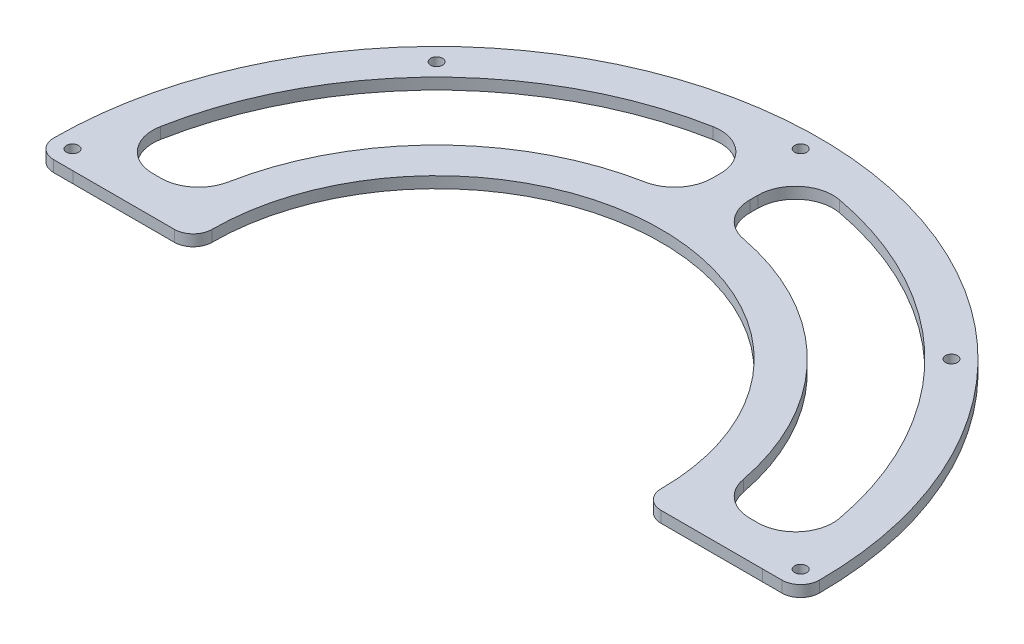
ISO-10303-21;
HEADER;
FILE_DESCRIPTION(('STEP AP214'),'2;1');
FILE_NAME('part.step','',(''),(''),'','','');
FILE_SCHEMA(('AUTOMOTIVE_DESIGN { 1 0 10303 214 1 1 1 1 }'));
ENDSEC;
DATA;
#1=APPLICATION_CONTEXT('core data for automotive mechanical design processes');
#2=APPLICATION_PROTOCOL_DEFINITION('international standard','automotive_design',2000,#1);
#3=PRODUCT_CONTEXT('',#1,'mechanical');
#4=PRODUCT('Part','Part','',(#3));
#5=PRODUCT_RELATED_PRODUCT_CATEGORY('part','',(#4));
#6=PRODUCT_DEFINITION_FORMATION('','',#4);
#7=PRODUCT_DEFINITION_CONTEXT('part definition',#1,'design');
#8=PRODUCT_DEFINITION('design','',#6,#7);
#9=PRODUCT_DEFINITION_SHAPE('','',#8);
#10=(LENGTH_UNIT() NAMED_UNIT(*) SI_UNIT(.MILLI.,.METRE.));
#11=(NAMED_UNIT(*) PLANE_ANGLE_UNIT() SI_UNIT($,.RADIAN.));
#12=(NAMED_UNIT(*) SI_UNIT($,.STERADIAN.) SOLID_ANGLE_UNIT());
#13=UNCERTAINTY_MEASURE_WITH_UNIT(LENGTH_MEASURE(1.E-05),#10,'distance_accuracy_value','');
#14=(GEOMETRIC_REPRESENTATION_CONTEXT(3) GLOBAL_UNCERTAINTY_ASSIGNED_CONTEXT((#13)) GLOBAL_UNIT_ASSIGNED_CONTEXT((#10,
#11,#12)) REPRESENTATION_CONTEXT('',''));
#15=CARTESIAN_POINT('',(0.,0.,0.));
#16=DIRECTION('',(0.,0.,1.));
#17=DIRECTION('',(1.,0.,0.));
#18=AXIS2_PLACEMENT_3D('',#15,#16,#17);
#19=CARTESIAN_POINT('',(14.9999999999932,3.,-80.514657050752));
#20=DIRECTION('',(0.,-1.,0.));
#21=DIRECTION('',(0.,0.,-1.));
#22=AXIS2_PLACEMENT_3D('',#19,#20,#21);
#23=CYLINDRICAL_SURFACE('',#22,9.99999999999999);
#24=CARTESIAN_POINT('',(14.9999999999932,0.,-80.514657050752));
#25=DIRECTION('',(0.,1.,0.));
#26=DIRECTION('',(0.,0.,1.));
#27=AXIS2_PLACEMENT_3D('',#24,#25,#26);
#28=CIRCLE('',#27,9.99999999999999);
#29=CARTESIAN_POINT('',(16.8315018314942,0.,-90.3455065074982));
#30=VERTEX_POINT('',#29);
#31=CARTESIAN_POINT('',(4.99999999999319,0.,-80.5146570507519));
#32=VERTEX_POINT('',#31);
#33=EDGE_CURVE('E358',#30,#32,#28,.T.);
#34=ORIENTED_EDGE('',*,*,#33,.F.);
#35=DIRECTION('',(0.,-1.,0.));
#36=VECTOR('',#35,1.);
#37=CARTESIAN_POINT('',(16.8315018314942,3.,-90.3455065074982));
#38=LINE('',#37,#36);
#39=CARTESIAN_POINT('',(16.8315018314942,3.,-90.3455065074982));
#40=VERTEX_POINT('',#39);
#41=EDGE_CURVE('E397',#40,#30,#38,.T.);
#42=ORIENTED_EDGE('',*,*,#41,.F.);
#43=CARTESIAN_POINT('',(14.9999999999932,3.,-80.514657050752));
#44=DIRECTION('',(0.,1.,0.));
#45=DIRECTION('',(0.,0.,1.));
#46=AXIS2_PLACEMENT_3D('',#43,#44,#45);
#47=CIRCLE('',#46,9.99999999999999);
#48=CARTESIAN_POINT('',(4.99999999999319,3.,-80.5146570507519));
#49=VERTEX_POINT('',#48);
#50=EDGE_CURVE('E285',#40,#49,#47,.T.);
#51=ORIENTED_EDGE('',*,*,#50,.T.);
#52=DIRECTION('',(0.,-1.,0.));
#53=VECTOR('',#52,1.);
#54=CARTESIAN_POINT('',(4.99999999999319,3.,-80.5146570507519));
#55=LINE('',#54,#53);
#56=EDGE_CURVE('E381',#49,#32,#55,.T.);
#57=ORIENTED_EDGE('',*,*,#56,.T.);
#58=EDGE_LOOP('',(#34,#42,#51,#57));
#59=FACE_BOUND('',#58,.T.);
#60=ADVANCED_FACE('F42',(#59),#23,.F.);
#61=CARTESIAN_POINT('',(0.,3.,0.));
#62=DIRECTION('',(0.,-1.,0.));
#63=DIRECTION('',(0.,0.,-1.));
#64=AXIS2_PLACEMENT_3D('',#61,#62,#63);
#65=CYLINDRICAL_SURFACE('',#64,91.9);
#66=CARTESIAN_POINT('',(0.,0.,0.));
#67=DIRECTION('',(0.,1.,0.));
#68=DIRECTION('',(0.,0.,1.));
#69=AXIS2_PLACEMENT_3D('',#66,#67,#68);
#70=CIRCLE('',#69,91.9);
#71=CARTESIAN_POINT('',(90.3455065074968,0.,-16.8315018315018));
#72=VERTEX_POINT('',#71);
#73=EDGE_CURVE('E361',#72,#30,#70,.T.);
#74=ORIENTED_EDGE('',*,*,#73,.F.);
#75=DIRECTION('',(0.,-1.,0.));
#76=VECTOR('',#75,1.);
#77=CARTESIAN_POINT('',(90.3455065074968,3.,-16.8315018315018));
#78=LINE('',#77,#76);
#79=CARTESIAN_POINT('',(90.3455065074968,3.,-16.8315018315018));
#80=VERTEX_POINT('',#79);
#81=EDGE_CURVE('E395',#80,#72,#78,.T.);
#82=ORIENTED_EDGE('',*,*,#81,.F.);
#83=CARTESIAN_POINT('',(0.,3.,0.));
#84=DIRECTION('',(0.,1.,0.));
#85=DIRECTION('',(0.,0.,1.));
#86=AXIS2_PLACEMENT_3D('',#83,#84,#85);
#87=CIRCLE('',#86,91.9);
#88=EDGE_CURVE('E288',#80,#40,#87,.T.);
#89=ORIENTED_EDGE('',*,*,#88,.T.);
#90=ORIENTED_EDGE('',*,*,#41,.T.);
#91=EDGE_LOOP('',(#74,#82,#89,#90));
#92=FACE_BOUND('',#91,.T.);
#93=ADVANCED_FACE('F499',(#92),#65,.F.);
#94=CARTESIAN_POINT('',(80.5146570507507,3.,-15.));
#95=DIRECTION('',(0.,-1.,0.));
#96=DIRECTION('',(0.,0.,-1.));
#97=AXIS2_PLACEMENT_3D('',#94,#95,#96);
#98=CYLINDRICAL_SURFACE('',#97,10.);
#99=CARTESIAN_POINT('',(80.5146570507507,0.,-15.));
#100=DIRECTION('',(0.,1.,0.));
#101=DIRECTION('',(0.,0.,1.));
#102=AXIS2_PLACEMENT_3D('',#99,#100,#101);
#103=CIRCLE('',#102,10.);
#104=CARTESIAN_POINT('',(80.5146570507507,0.,-5.));
#105=VERTEX_POINT('',#104);
#106=EDGE_CURVE('E364',#105,#72,#103,.T.);
#107=ORIENTED_EDGE('',*,*,#106,.F.);
#108=DIRECTION('',(0.,-1.,0.));
#109=VECTOR('',#108,1.);
#110=CARTESIAN_POINT('',(80.5146570507507,3.,-5.));
#111=LINE('',#110,#109);
#112=CARTESIAN_POINT('',(80.5146570507507,3.,-5.));
#113=VERTEX_POINT('',#112);
#114=EDGE_CURVE('E393',#113,#105,#111,.T.);
#115=ORIENTED_EDGE('',*,*,#114,.F.);
#116=CARTESIAN_POINT('',(80.5146570507507,3.,-15.));
#117=DIRECTION('',(0.,1.,0.));
#118=DIRECTION('',(0.,0.,1.));
#119=AXIS2_PLACEMENT_3D('',#116,#117,#118);
#120=CIRCLE('',#119,10.);
#121=EDGE_CURVE('E291',#113,#80,#120,.T.);
#122=ORIENTED_EDGE('',*,*,#121,.T.);
#123=ORIENTED_EDGE('',*,*,#81,.T.);
#124=EDGE_LOOP('',(#107,#115,#122,#123));
#125=FACE_BOUND('',#124,.T.);
#126=ADVANCED_FACE('F505',(#125),#98,.F.);
#127=CARTESIAN_POINT('',(0.,3.,-5.));
#128=DIRECTION('',(0.,0.,-1.));
#129=DIRECTION('',(-1.,0.,0.));
#130=AXIS2_PLACEMENT_3D('',#127,#128,#129);
#131=PLANE('',#130);
#132=DIRECTION('',(1.,0.,0.));
#133=VECTOR('',#132,1.);
#134=CARTESIAN_POINT('',(0.,0.,-5.));
#135=LINE('',#134,#133);
#136=CARTESIAN_POINT('',(78.3470031334958,0.,-5.));
#137=VERTEX_POINT('',#136);
#138=EDGE_CURVE('E367',#137,#105,#135,.T.);
#139=ORIENTED_EDGE('',*,*,#138,.F.);
#140=DIRECTION('',(0.,-1.,0.));
#141=VECTOR('',#140,1.);
#142=CARTESIAN_POINT('',(78.3470031334958,3.,-5.));
#143=LINE('',#142,#141);
#144=CARTESIAN_POINT('',(78.3470031334958,3.,-5.));
#145=VERTEX_POINT('',#144);
#146=EDGE_CURVE('E391',#145,#137,#143,.T.);
#147=ORIENTED_EDGE('',*,*,#146,.F.);
#148=DIRECTION('',(1.,0.,0.));
#149=VECTOR('',#148,1.);
#150=CARTESIAN_POINT('',(0.,3.,-5.));
#151=LINE('',#150,#149);
#152=EDGE_CURVE('E294',#145,#113,#151,.T.);
#153=ORIENTED_EDGE('',*,*,#152,.T.);
#154=ORIENTED_EDGE('',*,*,#114,.T.);
#155=EDGE_LOOP('',(#139,#147,#153,#154));
#156=FACE_BOUND('',#155,.T.);
#157=ADVANCED_FACE('F787',(#156),#131,.T.);
#158=CARTESIAN_POINT('',(78.3470031334958,3.,-15.));
#159=DIRECTION('',(0.,-1.,0.));
#160=DIRECTION('',(0.,0.,-1.));
#161=AXIS2_PLACEMENT_3D('',#158,#159,#160);
#162=CYLINDRICAL_SURFACE('',#161,9.99999999999999);
#163=CARTESIAN_POINT('',(78.3470031334958,0.,-15.));
#164=DIRECTION('',(0.,1.,0.));
#165=DIRECTION('',(0.,0.,1.));
#166=AXIS2_PLACEMENT_3D('',#163,#164,#165);
#167=CIRCLE('',#166,9.99999999999999);
#168=CARTESIAN_POINT('',(68.5253906057916,0.,-13.1195938322678));
#169=VERTEX_POINT('',#168);
#170=EDGE_CURVE('E370',#137,#169,#167,.F.);
#171=ORIENTED_EDGE('',*,*,#170,.T.);
#172=DIRECTION('',(0.,-1.,0.));
#173=VECTOR('',#172,1.);
#174=CARTESIAN_POINT('',(68.5253906057916,3.,-13.1195938322678));
#175=LINE('',#174,#173);
#176=CARTESIAN_POINT('',(68.5253906057916,3.,-13.1195938322678));
#177=VERTEX_POINT('',#176);
#178=EDGE_CURVE('E388',#177,#169,#175,.T.);
#179=ORIENTED_EDGE('',*,*,#178,.F.);
#180=CARTESIAN_POINT('',(78.3470031334958,3.,-15.));
#181=DIRECTION('',(0.,1.,0.));
#182=DIRECTION('',(0.,0.,1.));
#183=AXIS2_PLACEMENT_3D('',#180,#181,#182);
#184=CIRCLE('',#183,9.99999999999999);
#185=EDGE_CURVE('E297',#145,#177,#184,.F.);
#186=ORIENTED_EDGE('',*,*,#185,.F.);
#187=ORIENTED_EDGE('',*,*,#146,.T.);
#188=EDGE_LOOP('',(#171,#179,#186,#187));
#189=FACE_BOUND('',#188,.T.);
#190=ADVANCED_FACE('F776',(#189),#162,.F.);
#191=CARTESIAN_POINT('',(0.,3.,0.));
#192=DIRECTION('',(0.,-1.,0.));
#193=DIRECTION('',(0.,0.,-1.));
#194=AXIS2_PLACEMENT_3D('',#191,#192,#193);
#195=CYLINDRICAL_SURFACE('',#194,69.77);
#196=CARTESIAN_POINT('',(0.,0.,0.));
#197=DIRECTION('',(0.,1.,0.));
#198=DIRECTION('',(0.,0.,1.));
#199=AXIS2_PLACEMENT_3D('',#196,#197,#198);
#200=CIRCLE('',#199,69.77);
#201=CARTESIAN_POINT('',(13.1195938322618,0.,-68.5253906057928));
#202=VERTEX_POINT('',#201);
#203=EDGE_CURVE('E373',#169,#202,#200,.T.);
#204=ORIENTED_EDGE('',*,*,#203,.T.);
#205=DIRECTION('',(0.,-1.,0.));
#206=VECTOR('',#205,1.);
#207=CARTESIAN_POINT('',(13.1195938322618,3.,-68.5253906057928));
#208=LINE('',#207,#206);
#209=CARTESIAN_POINT('',(13.1195938322618,3.,-68.5253906057928));
#210=VERTEX_POINT('',#209);
#211=EDGE_CURVE('E386',#210,#202,#208,.T.);
#212=ORIENTED_EDGE('',*,*,#211,.F.);
#213=CARTESIAN_POINT('',(0.,3.,0.));
#214=DIRECTION('',(0.,1.,0.));
#215=DIRECTION('',(0.,0.,1.));
#216=AXIS2_PLACEMENT_3D('',#213,#214,#215);
#217=CIRCLE('',#216,69.77);
#218=EDGE_CURVE('E300',#177,#210,#217,.T.);
#219=ORIENTED_EDGE('',*,*,#218,.F.);
#220=ORIENTED_EDGE('',*,*,#178,.T.);
#221=EDGE_LOOP('',(#204,#212,#219,#220));
#222=FACE_BOUND('',#221,.T.);
#223=ADVANCED_FACE('F765',(#222),#195,.T.);
#224=CARTESIAN_POINT('',(14.9999999999932,3.,-78.3470031334971));
#225=DIRECTION('',(0.,-1.,0.));
#226=DIRECTION('',(0.,0.,-1.));
#227=AXIS2_PLACEMENT_3D('',#224,#225,#226);
#228=CYLINDRICAL_SURFACE('',#227,10.);
#229=CARTESIAN_POINT('',(14.9999999999932,0.,-78.3470031334971));
#230=DIRECTION('',(0.,1.,0.));
#231=DIRECTION('',(0.,0.,1.));
#232=AXIS2_PLACEMENT_3D('',#229,#230,#231);
#233=CIRCLE('',#232,10.);
#234=CARTESIAN_POINT('',(4.99999999999319,0.,-78.3470031334971));
#235=VERTEX_POINT('',#234);
#236=EDGE_CURVE('E376',#235,#202,#233,.T.);
#237=ORIENTED_EDGE('',*,*,#236,.F.);
#238=DIRECTION('',(0.,-1.,0.));
#239=VECTOR('',#238,1.);
#240=CARTESIAN_POINT('',(4.99999999999319,3.,-78.3470031334971));
#241=LINE('',#240,#239);
#242=CARTESIAN_POINT('',(4.99999999999319,3.,-78.3470031334971));
#243=VERTEX_POINT('',#242);
#244=EDGE_CURVE('E383',#243,#235,#241,.T.);
#245=ORIENTED_EDGE('',*,*,#244,.F.);
#246=CARTESIAN_POINT('',(14.9999999999932,3.,-78.3470031334971));
#247=DIRECTION('',(0.,1.,0.));
#248=DIRECTION('',(0.,0.,1.));
#249=AXIS2_PLACEMENT_3D('',#246,#247,#248);
#250=CIRCLE('',#249,10.);
#251=EDGE_CURVE('E302',#243,#210,#250,.T.);
#252=ORIENTED_EDGE('',*,*,#251,.T.);
#253=ORIENTED_EDGE('',*,*,#211,.T.);
#254=EDGE_LOOP('',(#237,#245,#252,#253));
#255=FACE_BOUND('',#254,.T.);
#256=ADVANCED_FACE('F612',(#255),#228,.F.);
#257=CARTESIAN_POINT('',(0.,3.,0.));
#258=DIRECTION('',(0.,-1.,0.));
#259=DIRECTION('',(0.,0.,-1.));
#260=AXIS2_PLACEMENT_3D('',#257,#258,#259);
#261=CYLINDRICAL_SURFACE('',#260,59.77);
#262=CARTESIAN_POINT('',(0.,0.,0.));
#263=DIRECTION('',(0.,1.,0.));
#264=DIRECTION('',(0.,0.,1.));
#265=AXIS2_PLACEMENT_3D('',#262,#263,#264);
#266=CIRCLE('',#265,59.77);
#267=CARTESIAN_POINT('',(59.77,0.,0.));
#268=VERTEX_POINT('',#267);
#269=CARTESIAN_POINT('',(-59.77,0.,0.));
#270=VERTEX_POINT('',#269);
#271=EDGE_CURVE('E327',#268,#270,#266,.T.);
#272=ORIENTED_EDGE('',*,*,#271,.F.);
#273=DIRECTION('',(0.,-1.,0.));
#274=VECTOR('',#273,1.);
#275=CARTESIAN_POINT('',(59.77,3.,0.));
#276=LINE('',#275,#274);
#277=CARTESIAN_POINT('',(59.77,3.,0.));
#278=VERTEX_POINT('',#277);
#279=EDGE_CURVE('E445',#268,#278,#276,.F.);
#280=ORIENTED_EDGE('',*,*,#279,.T.);
#281=CARTESIAN_POINT('',(0.,3.,0.));
#282=DIRECTION('',(0.,1.,0.));
#283=DIRECTION('',(0.,0.,1.));
#284=AXIS2_PLACEMENT_3D('',#281,#282,#283);
#285=CIRCLE('',#284,59.77);
#286=CARTESIAN_POINT('',(-59.77,3.,0.));
#287=VERTEX_POINT('',#286);
#288=EDGE_CURVE('E255',#278,#287,#285,.T.);
#289=ORIENTED_EDGE('',*,*,#288,.T.);
#290=DIRECTION('',(0.,-1.,0.));
#291=VECTOR('',#290,1.);
#292=CARTESIAN_POINT('',(-59.77,3.,0.));
#293=LINE('',#292,#291);
#294=EDGE_CURVE('E442',#287,#270,#293,.T.);
#295=ORIENTED_EDGE('',*,*,#294,.T.);
#296=EDGE_LOOP('',(#272,#280,#289,#295));
#297=FACE_BOUND('',#296,.T.);
#298=ADVANCED_FACE('F464',(#297),#261,.F.);
#299=CARTESIAN_POINT('',(0.,3.,5.));
#300=DIRECTION('',(0.,0.,1.));
#301=DIRECTION('',(1.,0.,0.));
#302=AXIS2_PLACEMENT_3D('',#299,#300,#301);
#303=PLANE('',#302);
#304=DIRECTION('',(-1.,0.,0.));
#305=VECTOR('',#304,1.);
#306=CARTESIAN_POINT('',(0.,3.,5.));
#307=LINE('',#306,#305);
#308=CARTESIAN_POINT('',(91.7638817836299,3.,5.));
#309=VERTEX_POINT('',#308);
#310=CARTESIAN_POINT('',(64.77,3.,5.));
#311=VERTEX_POINT('',#310);
#312=EDGE_CURVE('E257',#309,#311,#307,.T.);
#313=ORIENTED_EDGE('',*,*,#312,.T.);
#314=DIRECTION('',(0.,-1.,0.));
#315=VECTOR('',#314,1.);
#316=CARTESIAN_POINT('',(64.77,3.,5.));
#317=LINE('',#316,#315);
#318=CARTESIAN_POINT('',(64.77,0.,5.));
#319=VERTEX_POINT('',#318);
#320=EDGE_CURVE('E435',#311,#319,#317,.T.);
#321=ORIENTED_EDGE('',*,*,#320,.T.);
#322=DIRECTION('',(-1.,0.,0.));
#323=VECTOR('',#322,1.);
#324=CARTESIAN_POINT('',(0.,0.,5.));
#325=LINE('',#324,#323);
#326=CARTESIAN_POINT('',(91.7638817836299,0.,5.));
#327=VERTEX_POINT('',#326);
#328=EDGE_CURVE('E330',#327,#319,#325,.T.);
#329=ORIENTED_EDGE('',*,*,#328,.F.);
#330=DIRECTION('',(0.,-1.,0.));
#331=VECTOR('',#330,1.);
#332=CARTESIAN_POINT('',(91.7638817836299,3.,5.));
#333=LINE('',#332,#331);
#334=EDGE_CURVE('E384',#309,#327,#333,.T.);
#335=ORIENTED_EDGE('',*,*,#334,.F.);
#336=EDGE_LOOP('',(#313,#321,#329,#335));
#337=FACE_BOUND('',#336,.T.);
#338=ADVANCED_FACE('F454',(#337),#303,.T.);
#339=CARTESIAN_POINT('',(0.00303306051619236,3.,5.05505698707375));
#340=DIRECTION('',(-0.000600005099445556,0.,-0.999999819996924));
#341=DIRECTION('',(-0.999999819996924,0.,0.000600005099445556));
#342=AXIS2_PLACEMENT_3D('',#339,#340,#341);
#343=PLANE('',#342);
#344=DIRECTION('',(0.999999819996924,0.,-0.000600005099445556));
#345=VECTOR('',#344,1.);
#346=CARTESIAN_POINT('',(0.00303306051619236,0.,5.05505698707375));
#347=LINE('',#346,#345);
#348=CARTESIAN_POINT('',(96.9029999764652,0.,4.99691650232261));
#349=VERTEX_POINT('',#348);
#350=EDGE_CURVE('E333',#327,#349,#347,.T.);
#351=ORIENTED_EDGE('',*,*,#350,.T.);
#352=DIRECTION('',(0.,-1.,0.));
#353=VECTOR('',#352,1.);
#354=CARTESIAN_POINT('',(96.9029999764652,3.,4.99691650232261));
#355=LINE('',#354,#353);
#356=CARTESIAN_POINT('',(96.9029999764652,3.,4.99691650232261));
#357=VERTEX_POINT('',#356);
#358=EDGE_CURVE('E426',#349,#357,#355,.F.);
#359=ORIENTED_EDGE('',*,*,#358,.T.);
#360=DIRECTION('',(0.999999819996924,0.,-0.000600005099445556));
#361=VECTOR('',#360,1.);
#362=CARTESIAN_POINT('',(0.00303306051619236,3.,5.05505698707375));
#363=LINE('',#362,#361);
#364=EDGE_CURVE('E260',#309,#357,#363,.T.);
#365=ORIENTED_EDGE('',*,*,#364,.F.);
#366=ORIENTED_EDGE('',*,*,#334,.T.);
#367=EDGE_LOOP('',(#351,#359,#365,#366));
#368=FACE_BOUND('',#367,.T.);
#369=ADVANCED_FACE('F489',(#368),#343,.F.);
#370=CARTESIAN_POINT('',(0.,3.,0.));
#371=DIRECTION('',(0.,-1.,0.));
#372=DIRECTION('',(0.,0.,-1.));
#373=AXIS2_PLACEMENT_3D('',#370,#371,#372);
#374=CYLINDRICAL_SURFACE('',#373,101.9);
#375=CARTESIAN_POINT('',(0.,3.,0.));
#376=DIRECTION('',(0.,1.,0.));
#377=DIRECTION('',(0.,0.,1.));
#378=AXIS2_PLACEMENT_3D('',#375,#376,#377);
#379=CIRCLE('',#378,101.9);
#380=CARTESIAN_POINT('',(101.899999948438,3.,-0.00324165842888722));
#381=VERTEX_POINT('',#380);
#382=CARTESIAN_POINT('',(-101.899999948438,3.,-0.00324165842888863));
#383=VERTEX_POINT('',#382);
#384=EDGE_CURVE('E263',#381,#383,#379,.T.);
#385=ORIENTED_EDGE('',*,*,#384,.F.);
#386=DIRECTION('',(0.,-1.,0.));
#387=VECTOR('',#386,1.);
#388=CARTESIAN_POINT('',(101.899999948438,3.,-0.00324165842888722));
#389=LINE('',#388,#387);
#390=CARTESIAN_POINT('',(101.899999948438,0.,-0.00324165842888722));
#391=VERTEX_POINT('',#390);
#392=EDGE_CURVE('E419',#381,#391,#389,.T.);
#393=ORIENTED_EDGE('',*,*,#392,.T.);
#394=CARTESIAN_POINT('',(0.,0.,0.));
#395=DIRECTION('',(0.,1.,0.));
#396=DIRECTION('',(0.,0.,1.));
#397=AXIS2_PLACEMENT_3D('',#394,#395,#396);
#398=CIRCLE('',#397,101.9);
#399=CARTESIAN_POINT('',(-101.899999948438,0.,-0.00324165842888863));
#400=VERTEX_POINT('',#399);
#401=EDGE_CURVE('E336',#391,#400,#398,.T.);
#402=ORIENTED_EDGE('',*,*,#401,.T.);
#403=DIRECTION('',(0.,-1.,0.));
#404=VECTOR('',#403,1.);
#405=CARTESIAN_POINT('',(-101.899999948438,3.,-0.00324165842888863));
#406=LINE('',#405,#404);
#407=EDGE_CURVE('E399',#400,#383,#406,.F.);
#408=ORIENTED_EDGE('',*,*,#407,.T.);
#409=EDGE_LOOP('',(#385,#393,#402,#408));
#410=FACE_BOUND('',#409,.T.);
#411=ADVANCED_FACE('F480',(#410),#374,.T.);
#412=CARTESIAN_POINT('',(-0.00303306051619147,3.,5.05505698707373));
#413=DIRECTION('',(0.000600005099445382,0.,-0.999999819996924));
#414=DIRECTION('',(-0.999999819996924,0.,-0.000600005099445382));
#415=AXIS2_PLACEMENT_3D('',#412,#413,#414);
#416=PLANE('',#415);
#417=DIRECTION('',(0.999999819996924,0.,0.000600005099445382));
#418=VECTOR('',#417,1.);
#419=CARTESIAN_POINT('',(-0.00303306051619147,3.,5.05505698707373));
#420=LINE('',#419,#418);
#421=CARTESIAN_POINT('',(-96.9029999764652,3.,4.99691650232261));
#422=VERTEX_POINT('',#421);
#423=CARTESIAN_POINT('',(-91.7638817836299,3.,5.));
#424=VERTEX_POINT('',#423);
#425=EDGE_CURVE('E266',#422,#424,#420,.T.);
#426=ORIENTED_EDGE('',*,*,#425,.F.);
#427=DIRECTION('',(0.,-1.,0.));
#428=VECTOR('',#427,1.);
#429=CARTESIAN_POINT('',(-96.9029999764652,3.,4.99691650232261));
#430=LINE('',#429,#428);
#431=CARTESIAN_POINT('',(-96.9029999764652,0.,4.99691650232261));
#432=VERTEX_POINT('',#431);
#433=EDGE_CURVE('E432',#422,#432,#430,.T.);
#434=ORIENTED_EDGE('',*,*,#433,.T.);
#435=DIRECTION('',(0.999999819996924,0.,0.000600005099445382));
#436=VECTOR('',#435,1.);
#437=CARTESIAN_POINT('',(-0.00303306051619147,0.,5.05505698707373));
#438=LINE('',#437,#436);
#439=CARTESIAN_POINT('',(-91.7638817836299,0.,5.));
#440=VERTEX_POINT('',#439);
#441=EDGE_CURVE('E339',#432,#440,#438,.T.);
#442=ORIENTED_EDGE('',*,*,#441,.T.);
#443=DIRECTION('',(0.,-1.,0.));
#444=VECTOR('',#443,1.);
#445=CARTESIAN_POINT('',(-91.7638817836299,3.,5.));
#446=LINE('',#445,#444);
#447=EDGE_CURVE('E226',#424,#440,#446,.T.);
#448=ORIENTED_EDGE('',*,*,#447,.F.);
#449=EDGE_LOOP('',(#426,#434,#442,#448));
#450=FACE_BOUND('',#449,.T.);
#451=ADVANCED_FACE('F473',(#450),#416,.F.);
#452=CARTESIAN_POINT('',(0.,3.,0.));
#453=DIRECTION('',(0.,-1.,0.));
#454=DIRECTION('',(0.,0.,-1.));
#455=AXIS2_PLACEMENT_3D('',#452,#453,#454);
#456=CYLINDRICAL_SURFACE('',#455,91.9);
#457=CARTESIAN_POINT('',(0.,0.,0.));
#458=DIRECTION('',(0.,1.,0.));
#459=DIRECTION('',(0.,0.,1.));
#460=AXIS2_PLACEMENT_3D('',#457,#458,#459);
#461=CIRCLE('',#460,91.9);
#462=CARTESIAN_POINT('',(-16.8315018315095,0.,-90.3455065074954));
#463=VERTEX_POINT('',#462);
#464=CARTESIAN_POINT('',(-90.3455065074968,0.,-16.8315018315018));
#465=VERTEX_POINT('',#464);
#466=EDGE_CURVE('E221',#463,#465,#461,.T.);
#467=ORIENTED_EDGE('',*,*,#466,.F.);
#468=DIRECTION('',(0.,-1.,0.));
#469=VECTOR('',#468,1.);
#470=CARTESIAN_POINT('',(-16.8315018315095,3.,-90.3455065074954));
#471=LINE('',#470,#469);
#472=CARTESIAN_POINT('',(-16.8315018315095,3.,-90.3455065074954));
#473=VERTEX_POINT('',#472);
#474=EDGE_CURVE('E216',#473,#463,#471,.T.);
#475=ORIENTED_EDGE('',*,*,#474,.F.);
#476=CARTESIAN_POINT('',(0.,3.,0.));
#477=DIRECTION('',(0.,1.,0.));
#478=DIRECTION('',(0.,0.,1.));
#479=AXIS2_PLACEMENT_3D('',#476,#477,#478);
#480=CIRCLE('',#479,91.9);
#481=CARTESIAN_POINT('',(-90.3455065074968,3.,-16.8315018315018));
#482=VERTEX_POINT('',#481);
#483=EDGE_CURVE('E219',#473,#482,#480,.T.);
#484=ORIENTED_EDGE('',*,*,#483,.T.);
#485=DIRECTION('',(0.,-1.,0.));
#486=VECTOR('',#485,1.);
#487=CARTESIAN_POINT('',(-90.3455065074968,3.,-16.8315018315018));
#488=LINE('',#487,#486);
#489=EDGE_CURVE('E308',#482,#465,#488,.T.);
#490=ORIENTED_EDGE('',*,*,#489,.T.);
#491=EDGE_LOOP('',(#467,#475,#484,#490));
#492=FACE_BOUND('',#491,.T.);
#493=ADVANCED_FACE('F218',(#492),#456,.F.);
#494=CARTESIAN_POINT('',(-15.0000000000068,3.,-80.5146570507494));
#495=DIRECTION('',(0.,-1.,0.));
#496=DIRECTION('',(0.,0.,-1.));
#497=AXIS2_PLACEMENT_3D('',#494,#495,#496);
#498=CYLINDRICAL_SURFACE('',#497,9.99999999999999);
#499=CARTESIAN_POINT('',(-15.0000000000068,0.,-80.5146570507494));
#500=DIRECTION('',(0.,1.,0.));
#501=DIRECTION('',(0.,0.,1.));
#502=AXIS2_PLACEMENT_3D('',#499,#500,#501);
#503=CIRCLE('',#502,9.99999999999999);
#504=CARTESIAN_POINT('',(-5.00000000000684,0.,-80.5146570507494));
#505=VERTEX_POINT('',#504);
#506=EDGE_CURVE('E310',#505,#463,#503,.T.);
#507=ORIENTED_EDGE('',*,*,#506,.F.);
#508=DIRECTION('',(0.,-1.,0.));
#509=VECTOR('',#508,1.);
#510=CARTESIAN_POINT('',(-5.00000000000684,3.,-80.5146570507494));
#511=LINE('',#510,#509);
#512=CARTESIAN_POINT('',(-5.00000000000684,3.,-80.5146570507494));
#513=VERTEX_POINT('',#512);
#514=EDGE_CURVE('E227',#513,#505,#511,.T.);
#515=ORIENTED_EDGE('',*,*,#514,.F.);
#516=CARTESIAN_POINT('',(-15.0000000000068,3.,-80.5146570507494));
#517=DIRECTION('',(0.,1.,0.));
#518=DIRECTION('',(0.,0.,1.));
#519=AXIS2_PLACEMENT_3D('',#516,#517,#518);
#520=CIRCLE('',#519,9.99999999999999);
#521=EDGE_CURVE('E232',#513,#473,#520,.T.);
#522=ORIENTED_EDGE('',*,*,#521,.T.);
#523=ORIENTED_EDGE('',*,*,#474,.T.);
#524=EDGE_LOOP('',(#507,#515,#522,#523));
#525=FACE_BOUND('',#524,.T.);
#526=ADVANCED_FACE('F239',(#525),#498,.F.);
#527=CARTESIAN_POINT('',(-5.00000000000671,3.,0.));
#528=DIRECTION('',(1.,0.,0.));
#529=DIRECTION('',(0.,0.,-1.));
#530=AXIS2_PLACEMENT_3D('',#527,#528,#529);
#531=PLANE('',#530);
#532=DIRECTION('',(0.,0.,1.));
#533=VECTOR('',#532,1.);
#534=CARTESIAN_POINT('',(-5.00000000000671,0.,0.));
#535=LINE('',#534,#533);
#536=CARTESIAN_POINT('',(-5.00000000000684,0.,-78.3470031334945));
#537=VERTEX_POINT('',#536);
#538=EDGE_CURVE('E312',#505,#537,#535,.T.);
#539=ORIENTED_EDGE('',*,*,#538,.T.);
#540=DIRECTION('',(0.,-1.,0.));
#541=VECTOR('',#540,1.);
#542=CARTESIAN_POINT('',(-5.00000000000684,3.,-78.3470031334945));
#543=LINE('',#542,#541);
#544=CARTESIAN_POINT('',(-5.00000000000684,3.,-78.3470031334945));
#545=VERTEX_POINT('',#544);
#546=EDGE_CURVE('E414',#545,#537,#543,.T.);
#547=ORIENTED_EDGE('',*,*,#546,.F.);
#548=DIRECTION('',(0.,0.,1.));
#549=VECTOR('',#548,1.);
#550=CARTESIAN_POINT('',(-5.00000000000671,3.,0.));
#551=LINE('',#550,#549);
#552=EDGE_CURVE('E241',#513,#545,#551,.T.);
#553=ORIENTED_EDGE('',*,*,#552,.F.);
#554=ORIENTED_EDGE('',*,*,#514,.T.);
#555=EDGE_LOOP('',(#539,#547,#553,#554));
#556=FACE_BOUND('',#555,.T.);
#557=ADVANCED_FACE('F543',(#556),#531,.F.);
#558=CARTESIAN_POINT('',(-15.0000000000068,3.,-78.3470031334945));
#559=DIRECTION('',(0.,-1.,0.));
#560=DIRECTION('',(0.,0.,-1.));
#561=AXIS2_PLACEMENT_3D('',#558,#559,#560);
#562=CYLINDRICAL_SURFACE('',#561,10.);
#563=CARTESIAN_POINT('',(-15.0000000000068,0.,-78.3470031334945));
#564=DIRECTION('',(0.,1.,0.));
#565=DIRECTION('',(0.,0.,1.));
#566=AXIS2_PLACEMENT_3D('',#563,#564,#565);
#567=CIRCLE('',#566,10.);
#568=CARTESIAN_POINT('',(-13.1195938322737,0.,-68.5253906057905));
#569=VERTEX_POINT('',#568);
#570=EDGE_CURVE('E314',#537,#569,#567,.F.);
#571=ORIENTED_EDGE('',*,*,#570,.T.);
#572=DIRECTION('',(0.,-1.,0.));
#573=VECTOR('',#572,1.);
#574=CARTESIAN_POINT('',(-13.1195938322737,3.,-68.5253906057905));
#575=LINE('',#574,#573);
#576=CARTESIAN_POINT('',(-13.1195938322737,3.,-68.5253906057905));
#577=VERTEX_POINT('',#576);
#578=EDGE_CURVE('E411',#577,#569,#575,.T.);
#579=ORIENTED_EDGE('',*,*,#578,.F.);
#580=CARTESIAN_POINT('',(-15.0000000000068,3.,-78.3470031334945));
#581=DIRECTION('',(0.,1.,0.));
#582=DIRECTION('',(0.,0.,1.));
#583=AXIS2_PLACEMENT_3D('',#580,#581,#582);
#584=CIRCLE('',#583,10.);
#585=EDGE_CURVE('E243',#545,#577,#584,.F.);
#586=ORIENTED_EDGE('',*,*,#585,.F.);
#587=ORIENTED_EDGE('',*,*,#546,.T.);
#588=EDGE_LOOP('',(#571,#579,#586,#587));
#589=FACE_BOUND('',#588,.T.);
#590=ADVANCED_FACE('F726',(#589),#562,.F.);
#591=CARTESIAN_POINT('',(0.,3.,0.));
#592=DIRECTION('',(0.,-1.,0.));
#593=DIRECTION('',(0.,0.,-1.));
#594=AXIS2_PLACEMENT_3D('',#591,#592,#593);
#595=CYLINDRICAL_SURFACE('',#594,69.77);
#596=CARTESIAN_POINT('',(0.,0.,0.));
#597=DIRECTION('',(0.,1.,0.));
#598=DIRECTION('',(0.,0.,1.));
#599=AXIS2_PLACEMENT_3D('',#596,#597,#598);
#600=CIRCLE('',#599,69.77);
#601=CARTESIAN_POINT('',(-68.5253906057916,0.,-13.1195938322678));
#602=VERTEX_POINT('',#601);
#603=EDGE_CURVE('E316',#569,#602,#600,.T.);
#604=ORIENTED_EDGE('',*,*,#603,.T.);
#605=DIRECTION('',(0.,-1.,0.));
#606=VECTOR('',#605,1.);
#607=CARTESIAN_POINT('',(-68.5253906057916,3.,-13.1195938322678));
#608=LINE('',#607,#606);
#609=CARTESIAN_POINT('',(-68.5253906057916,3.,-13.1195938322678));
#610=VERTEX_POINT('',#609);
#611=EDGE_CURVE('E408',#610,#602,#608,.T.);
#612=ORIENTED_EDGE('',*,*,#611,.F.);
#613=CARTESIAN_POINT('',(0.,3.,0.));
#614=DIRECTION('',(0.,1.,0.));
#615=DIRECTION('',(0.,0.,1.));
#616=AXIS2_PLACEMENT_3D('',#613,#614,#615);
#617=CIRCLE('',#616,69.77);
#618=EDGE_CURVE('E247',#577,#610,#617,.T.);
#619=ORIENTED_EDGE('',*,*,#618,.F.);
#620=ORIENTED_EDGE('',*,*,#578,.T.);
#621=EDGE_LOOP('',(#604,#612,#619,#620));
#622=FACE_BOUND('',#621,.T.);
#623=ADVANCED_FACE('F715',(#622),#595,.T.);
#624=CARTESIAN_POINT('',(-78.3470031334958,3.,-15.));
#625=DIRECTION('',(0.,-1.,0.));
#626=DIRECTION('',(0.,0.,-1.));
#627=AXIS2_PLACEMENT_3D('',#624,#625,#626);
#628=CYLINDRICAL_SURFACE('',#627,9.99999999999999);
#629=CARTESIAN_POINT('',(-78.3470031334958,0.,-15.));
#630=DIRECTION('',(0.,1.,0.));
#631=DIRECTION('',(0.,0.,1.));
#632=AXIS2_PLACEMENT_3D('',#629,#630,#631);
#633=CIRCLE('',#632,9.99999999999999);
#634=CARTESIAN_POINT('',(-78.3470031334958,0.,-5.));
#635=VERTEX_POINT('',#634);
#636=EDGE_CURVE('E318',#602,#635,#633,.F.);
#637=ORIENTED_EDGE('',*,*,#636,.T.);
#638=DIRECTION('',(0.,-1.,0.));
#639=VECTOR('',#638,1.);
#640=CARTESIAN_POINT('',(-78.3470031334958,3.,-5.));
#641=LINE('',#640,#639);
#642=CARTESIAN_POINT('',(-78.3470031334958,3.,-5.));
#643=VERTEX_POINT('',#642);
#644=EDGE_CURVE('E406',#643,#635,#641,.T.);
#645=ORIENTED_EDGE('',*,*,#644,.F.);
#646=CARTESIAN_POINT('',(-78.3470031334958,3.,-15.));
#647=DIRECTION('',(0.,1.,0.));
#648=DIRECTION('',(0.,0.,1.));
#649=AXIS2_PLACEMENT_3D('',#646,#647,#648);
#650=CIRCLE('',#649,9.99999999999999);
#651=EDGE_CURVE('E249',#610,#643,#650,.F.);
#652=ORIENTED_EDGE('',*,*,#651,.F.);
#653=ORIENTED_EDGE('',*,*,#611,.T.);
#654=EDGE_LOOP('',(#637,#645,#652,#653));
#655=FACE_BOUND('',#654,.T.);
#656=ADVANCED_FACE('F704',(#655),#628,.F.);
#657=CARTESIAN_POINT('',(0.,3.,-5.));
#658=DIRECTION('',(0.,0.,-1.));
#659=DIRECTION('',(-1.,0.,0.));
#660=AXIS2_PLACEMENT_3D('',#657,#658,#659);
#661=PLANE('',#660);
#662=DIRECTION('',(1.,0.,0.));
#663=VECTOR('',#662,1.);
#664=CARTESIAN_POINT('',(0.,0.,-5.));
#665=LINE('',#664,#663);
#666=CARTESIAN_POINT('',(-80.5146570507507,0.,-5.));
#667=VERTEX_POINT('',#666);
#668=EDGE_CURVE('E321',#667,#635,#665,.T.);
#669=ORIENTED_EDGE('',*,*,#668,.F.);
#670=DIRECTION('',(0.,-1.,0.));
#671=VECTOR('',#670,1.);
#672=CARTESIAN_POINT('',(-80.5146570507507,3.,-5.));
#673=LINE('',#672,#671);
#674=CARTESIAN_POINT('',(-80.5146570507507,3.,-5.));
#675=VERTEX_POINT('',#674);
#676=EDGE_CURVE('E404',#675,#667,#673,.T.);
#677=ORIENTED_EDGE('',*,*,#676,.F.);
#678=DIRECTION('',(1.,0.,0.));
#679=VECTOR('',#678,1.);
#680=CARTESIAN_POINT('',(0.,3.,-5.));
#681=LINE('',#680,#679);
#682=EDGE_CURVE('E251',#675,#643,#681,.T.);
#683=ORIENTED_EDGE('',*,*,#682,.T.);
#684=ORIENTED_EDGE('',*,*,#644,.T.);
#685=EDGE_LOOP('',(#669,#677,#683,#684));
#686=FACE_BOUND('',#685,.T.);
#687=ADVANCED_FACE('F515',(#686),#661,.T.);
#688=CARTESIAN_POINT('',(0.,3.,-96.9));
#689=DIRECTION('',(0.,-1.,0.));
#690=DIRECTION('',(0.,0.,-1.));
#691=AXIS2_PLACEMENT_3D('',#688,#689,#690);
#692=CYLINDRICAL_SURFACE('',#691,1.6);
#693=CARTESIAN_POINT('',(0.,3.,-96.9));
#694=DIRECTION('',(0.,1.,0.));
#695=DIRECTION('',(0.,0.,1.));
#696=AXIS2_PLACEMENT_3D('',#693,#694,#695);
#697=CIRCLE('',#696,1.6);
#698=CARTESIAN_POINT('',(0.,3.,-95.3));
#699=VERTEX_POINT('',#698);
#700=EDGE_CURVE('E282',#699,#699,#697,.T.);
#701=ORIENTED_EDGE('',*,*,#700,.T.);
#702=EDGE_LOOP('',(#701));
#703=FACE_BOUND('',#702,.T.);
#704=CARTESIAN_POINT('',(0.,0.,-96.9));
#705=DIRECTION('',(0.,1.,0.));
#706=DIRECTION('',(0.,0.,1.));
#707=AXIS2_PLACEMENT_3D('',#704,#705,#706);
#708=CIRCLE('',#707,1.6);
#709=CARTESIAN_POINT('',(0.,0.,-95.3));
#710=VERTEX_POINT('',#709);
#711=EDGE_CURVE('E355',#710,#710,#708,.T.);
#712=ORIENTED_EDGE('',*,*,#711,.F.);
#713=EDGE_LOOP('',(#712));
#714=FACE_BOUND('',#713,.T.);
#715=ADVANCED_FACE('F511',(#703,#714),#692,.F.);
#716=CARTESIAN_POINT('',(68.5186470969766,3.,-68.5186470969764));
#717=DIRECTION('',(0.,-1.,0.));
#718=DIRECTION('',(0.,0.,-1.));
#719=AXIS2_PLACEMENT_3D('',#716,#717,#718);
#720=CYLINDRICAL_SURFACE('',#719,1.6);
#721=CARTESIAN_POINT('',(68.5186470969766,3.,-68.5186470969764));
#722=DIRECTION('',(0.,1.,0.));
#723=DIRECTION('',(0.,0.,1.));
#724=AXIS2_PLACEMENT_3D('',#721,#722,#723);
#725=CIRCLE('',#724,1.6);
#726=CARTESIAN_POINT('',(68.5186470969766,3.,-66.9186470969763));
#727=VERTEX_POINT('',#726);
#728=EDGE_CURVE('E279',#727,#727,#725,.T.);
#729=ORIENTED_EDGE('',*,*,#728,.T.);
#730=EDGE_LOOP('',(#729));
#731=FACE_BOUND('',#730,.T.);
#732=CARTESIAN_POINT('',(68.5186470969766,0.,-68.5186470969764));
#733=DIRECTION('',(0.,1.,0.));
#734=DIRECTION('',(0.,0.,1.));
#735=AXIS2_PLACEMENT_3D('',#732,#733,#734);
#736=CIRCLE('',#735,1.6);
#737=CARTESIAN_POINT('',(68.5186470969766,0.,-66.9186470969763));
#738=VERTEX_POINT('',#737);
#739=EDGE_CURVE('E352',#738,#738,#736,.T.);
#740=ORIENTED_EDGE('',*,*,#739,.F.);
#741=EDGE_LOOP('',(#740));
#742=FACE_BOUND('',#741,.T.);
#743=ADVANCED_FACE('F514',(#731,#742),#720,.F.);
#744=CARTESIAN_POINT('',(96.9,3.,3.383245417339E-13));
#745=DIRECTION('',(0.,-1.,0.));
#746=DIRECTION('',(0.,0.,-1.));
#747=AXIS2_PLACEMENT_3D('',#744,#745,#746);
#748=CYLINDRICAL_SURFACE('',#747,1.60000000000001);
#749=CARTESIAN_POINT('',(96.9,3.,3.383245417339E-13));
#750=DIRECTION('',(0.,1.,0.));
#751=DIRECTION('',(0.,0.,1.));
#752=AXIS2_PLACEMENT_3D('',#749,#750,#751);
#753=CIRCLE('',#752,1.60000000000001);
#754=CARTESIAN_POINT('',(96.9,3.,1.60000000000035));
#755=VERTEX_POINT('',#754);
#756=EDGE_CURVE('E276',#755,#755,#753,.T.);
#757=ORIENTED_EDGE('',*,*,#756,.T.);
#758=EDGE_LOOP('',(#757));
#759=FACE_BOUND('',#758,.T.);
#760=CARTESIAN_POINT('',(96.9,0.,3.383245417339E-13));
#761=DIRECTION('',(0.,1.,0.));
#762=DIRECTION('',(0.,0.,1.));
#763=AXIS2_PLACEMENT_3D('',#760,#761,#762);
#764=CIRCLE('',#763,1.60000000000001);
#765=CARTESIAN_POINT('',(96.9,0.,1.60000000000035));
#766=VERTEX_POINT('',#765);
#767=EDGE_CURVE('E349',#766,#766,#764,.T.);
#768=ORIENTED_EDGE('',*,*,#767,.F.);
#769=EDGE_LOOP('',(#768));
#770=FACE_BOUND('',#769,.T.);
#771=ADVANCED_FACE('F519',(#759,#770),#748,.F.);
#772=CARTESIAN_POINT('',(-96.9,3.,-1.0149736252017E-12));
#773=DIRECTION('',(0.,-1.,0.));
#774=DIRECTION('',(0.,0.,-1.));
#775=AXIS2_PLACEMENT_3D('',#772,#773,#774);
#776=CYLINDRICAL_SURFACE('',#775,1.60000000000001);
#777=CARTESIAN_POINT('',(-96.9,3.,-1.0149736252017E-12));
#778=DIRECTION('',(0.,1.,0.));
#779=DIRECTION('',(0.,0.,1.));
#780=AXIS2_PLACEMENT_3D('',#777,#778,#779);
#781=CIRCLE('',#780,1.60000000000001);
#782=CARTESIAN_POINT('',(-96.9,3.,1.59999999999899));
#783=VERTEX_POINT('',#782);
#784=EDGE_CURVE('E273',#783,#783,#781,.T.);
#785=ORIENTED_EDGE('',*,*,#784,.T.);
#786=EDGE_LOOP('',(#785));
#787=FACE_BOUND('',#786,.T.);
#788=CARTESIAN_POINT('',(-96.9,0.,-1.0149736252017E-12));
#789=DIRECTION('',(0.,1.,0.));
#790=DIRECTION('',(0.,0.,1.));
#791=AXIS2_PLACEMENT_3D('',#788,#789,#790);
#792=CIRCLE('',#791,1.60000000000001);
#793=CARTESIAN_POINT('',(-96.9,0.,1.59999999999899));
#794=VERTEX_POINT('',#793);
#795=EDGE_CURVE('E346',#794,#794,#792,.T.);
#796=ORIENTED_EDGE('',*,*,#795,.F.);
#797=EDGE_LOOP('',(#796));
#798=FACE_BOUND('',#797,.T.);
#799=ADVANCED_FACE('F523',(#787,#798),#776,.F.);
#800=CARTESIAN_POINT('',(-68.5186470969756,3.,-68.5186470969773));
#801=DIRECTION('',(0.,-1.,0.));
#802=DIRECTION('',(0.,0.,-1.));
#803=AXIS2_PLACEMENT_3D('',#800,#801,#802);
#804=CYLINDRICAL_SURFACE('',#803,1.59999999999999);
#805=CARTESIAN_POINT('',(-68.5186470969756,3.,-68.5186470969773));
#806=DIRECTION('',(0.,1.,0.));
#807=DIRECTION('',(0.,0.,1.));
#808=AXIS2_PLACEMENT_3D('',#805,#806,#807);
#809=CIRCLE('',#808,1.59999999999999);
#810=CARTESIAN_POINT('',(-68.5186470969756,3.,-66.9186470969773));
#811=VERTEX_POINT('',#810);
#812=EDGE_CURVE('E270',#811,#811,#809,.T.);
#813=ORIENTED_EDGE('',*,*,#812,.T.);
#814=EDGE_LOOP('',(#813));
#815=FACE_BOUND('',#814,.T.);
#816=CARTESIAN_POINT('',(-68.5186470969756,0.,-68.5186470969773));
#817=DIRECTION('',(0.,1.,0.));
#818=DIRECTION('',(0.,0.,1.));
#819=AXIS2_PLACEMENT_3D('',#816,#817,#818);
#820=CIRCLE('',#819,1.59999999999999);
#821=CARTESIAN_POINT('',(-68.5186470969756,0.,-66.9186470969773));
#822=VERTEX_POINT('',#821);
#823=EDGE_CURVE('E343',#822,#822,#820,.T.);
#824=ORIENTED_EDGE('',*,*,#823,.F.);
#825=EDGE_LOOP('',(#824));
#826=FACE_BOUND('',#825,.T.);
#827=ADVANCED_FACE('F527',(#815,#826),#804,.F.);
#828=CARTESIAN_POINT('',(0.,3.,5.));
#829=DIRECTION('',(0.,0.,-1.));
#830=DIRECTION('',(-1.,0.,0.));
#831=AXIS2_PLACEMENT_3D('',#828,#829,#830);
#832=PLANE('',#831);
#833=DIRECTION('',(1.,0.,0.));
#834=VECTOR('',#833,1.);
#835=CARTESIAN_POINT('',(0.,0.,5.));
#836=LINE('',#835,#834);
#837=CARTESIAN_POINT('',(-64.77,0.,5.));
#838=VERTEX_POINT('',#837);
#839=EDGE_CURVE('E341',#440,#838,#836,.T.);
#840=ORIENTED_EDGE('',*,*,#839,.T.);
#841=DIRECTION('',(0.,1.,0.));
#842=VECTOR('',#841,1.);
#843=CARTESIAN_POINT('',(-64.77,3.,5.));
#844=LINE('',#843,#842);
#845=CARTESIAN_POINT('',(-64.77,3.,5.));
#846=VERTEX_POINT('',#845);
#847=EDGE_CURVE('E11',#838,#846,#844,.T.);
#848=ORIENTED_EDGE('',*,*,#847,.T.);
#849=DIRECTION('',(1.,0.,0.));
#850=VECTOR('',#849,1.);
#851=CARTESIAN_POINT('',(0.,3.,5.));
#852=LINE('',#851,#850);
#853=EDGE_CURVE('E268',#424,#846,#852,.T.);
#854=ORIENTED_EDGE('',*,*,#853,.F.);
#855=ORIENTED_EDGE('',*,*,#447,.T.);
#856=EDGE_LOOP('',(#840,#848,#854,#855));
#857=FACE_BOUND('',#856,.T.);
#858=ADVANCED_FACE('F469',(#857),#832,.F.);
#859=CARTESIAN_POINT('',(-80.5146570507507,3.,-15.));
#860=DIRECTION('',(0.,-1.,0.));
#861=DIRECTION('',(0.,0.,-1.));
#862=AXIS2_PLACEMENT_3D('',#859,#860,#861);
#863=CYLINDRICAL_SURFACE('',#862,10.);
#864=CARTESIAN_POINT('',(-80.5146570507507,0.,-15.));
#865=DIRECTION('',(0.,1.,0.));
#866=DIRECTION('',(0.,0.,1.));
#867=AXIS2_PLACEMENT_3D('',#864,#865,#866);
#868=CIRCLE('',#867,10.);
#869=EDGE_CURVE('E324',#667,#465,#868,.F.);
#870=ORIENTED_EDGE('',*,*,#869,.T.);
#871=ORIENTED_EDGE('',*,*,#489,.F.);
#872=CARTESIAN_POINT('',(-80.5146570507507,3.,-15.));
#873=DIRECTION('',(0.,1.,0.));
#874=DIRECTION('',(0.,0.,1.));
#875=AXIS2_PLACEMENT_3D('',#872,#873,#874);
#876=CIRCLE('',#875,10.);
#877=EDGE_CURVE('E235',#675,#482,#876,.F.);
#878=ORIENTED_EDGE('',*,*,#877,.F.);
#879=ORIENTED_EDGE('',*,*,#676,.T.);
#880=EDGE_LOOP('',(#870,#871,#878,#879));
#881=FACE_BOUND('',#880,.T.);
#882=ADVANCED_FACE('F534',(#881),#863,.F.);
#883=CARTESIAN_POINT('',(4.99999999999319,3.,0.));
#884=DIRECTION('',(1.,0.,0.));
#885=DIRECTION('',(0.,0.,-1.));
#886=AXIS2_PLACEMENT_3D('',#883,#884,#885);
#887=PLANE('',#886);
#888=DIRECTION('',(0.,0.,1.));
#889=VECTOR('',#888,1.);
#890=CARTESIAN_POINT('',(4.99999999999319,0.,0.));
#891=LINE('',#890,#889);
#892=EDGE_CURVE('E237',#32,#235,#891,.T.);
#893=ORIENTED_EDGE('',*,*,#892,.F.);
#894=ORIENTED_EDGE('',*,*,#56,.F.);
#895=DIRECTION('',(0.,0.,1.));
#896=VECTOR('',#895,1.);
#897=CARTESIAN_POINT('',(4.99999999999319,3.,0.));
#898=LINE('',#897,#896);
#899=EDGE_CURVE('E305',#49,#243,#898,.T.);
#900=ORIENTED_EDGE('',*,*,#899,.T.);
#901=ORIENTED_EDGE('',*,*,#244,.T.);
#902=EDGE_LOOP('',(#893,#894,#900,#901));
#903=FACE_BOUND('',#902,.T.);
#904=ADVANCED_FACE('F583',(#903),#887,.T.);
#905=CARTESIAN_POINT('',(0.,3.,0.));
#906=DIRECTION('',(0.,1.,0.));
#907=DIRECTION('',(0.,0.,1.));
#908=AXIS2_PLACEMENT_3D('',#905,#906,#907);
#909=PLANE('',#908);
#910=ORIENTED_EDGE('',*,*,#483,.F.);
#911=ORIENTED_EDGE('',*,*,#521,.F.);
#912=ORIENTED_EDGE('',*,*,#552,.T.);
#913=ORIENTED_EDGE('',*,*,#585,.T.);
#914=ORIENTED_EDGE('',*,*,#618,.T.);
#915=ORIENTED_EDGE('',*,*,#651,.T.);
#916=ORIENTED_EDGE('',*,*,#682,.F.);
#917=ORIENTED_EDGE('',*,*,#877,.T.);
#918=EDGE_LOOP('',(#910,#911,#912,#913,#914,#915,#916,#917));
#919=FACE_BOUND('',#918,.T.);
#920=ORIENTED_EDGE('',*,*,#288,.F.);
#921=CARTESIAN_POINT('',(64.77,3.,0.));
#922=DIRECTION('',(0.,1.,0.));
#923=DIRECTION('',(0.,0.,1.));
#924=AXIS2_PLACEMENT_3D('',#921,#922,#923);
#925=CIRCLE('',#924,5.);
#926=EDGE_CURVE('E50',#278,#311,#925,.T.);
#927=ORIENTED_EDGE('',*,*,#926,.T.);
#928=ORIENTED_EDGE('',*,*,#312,.F.);
#929=ORIENTED_EDGE('',*,*,#364,.T.);
#930=CARTESIAN_POINT('',(96.899999950968,3.,-0.00308259766201346));
#931=DIRECTION('',(0.,1.,0.));
#932=DIRECTION('',(0.,0.,1.));
#933=AXIS2_PLACEMENT_3D('',#930,#931,#932);
#934=CIRCLE('',#933,5.);
#935=EDGE_CURVE('E430',#357,#381,#934,.T.);
#936=ORIENTED_EDGE('',*,*,#935,.T.);
#937=ORIENTED_EDGE('',*,*,#384,.T.);
#938=CARTESIAN_POINT('',(-96.899999950968,3.,-0.0030825976620148));
#939=DIRECTION('',(0.,1.,0.));
#940=DIRECTION('',(0.,0.,1.));
#941=AXIS2_PLACEMENT_3D('',#938,#939,#940);
#942=CIRCLE('',#941,5.);
#943=EDGE_CURVE('E428',#383,#422,#942,.T.);
#944=ORIENTED_EDGE('',*,*,#943,.T.);
#945=ORIENTED_EDGE('',*,*,#425,.T.);
#946=ORIENTED_EDGE('',*,*,#853,.T.);
#947=CARTESIAN_POINT('',(-64.77,3.,0.));
#948=DIRECTION('',(0.,1.,0.));
#949=DIRECTION('',(0.,0.,1.));
#950=AXIS2_PLACEMENT_3D('',#947,#948,#949);
#951=CIRCLE('',#950,5.);
#952=EDGE_CURVE('E62',#846,#287,#951,.T.);
#953=ORIENTED_EDGE('',*,*,#952,.T.);
#954=EDGE_LOOP('',(#920,#927,#928,#929,#936,#937,#944,#945,#946,#953));
#955=FACE_BOUND('',#954,.T.);
#956=ORIENTED_EDGE('',*,*,#812,.F.);
#957=EDGE_LOOP('',(#956));
#958=FACE_BOUND('',#957,.T.);
#959=ORIENTED_EDGE('',*,*,#784,.F.);
#960=EDGE_LOOP('',(#959));
#961=FACE_BOUND('',#960,.T.);
#962=ORIENTED_EDGE('',*,*,#756,.F.);
#963=EDGE_LOOP('',(#962));
#964=FACE_BOUND('',#963,.T.);
#965=ORIENTED_EDGE('',*,*,#728,.F.);
#966=EDGE_LOOP('',(#965));
#967=FACE_BOUND('',#966,.T.);
#968=ORIENTED_EDGE('',*,*,#700,.F.);
#969=EDGE_LOOP('',(#968));
#970=FACE_BOUND('',#969,.T.);
#971=ORIENTED_EDGE('',*,*,#50,.F.);
#972=ORIENTED_EDGE('',*,*,#88,.F.);
#973=ORIENTED_EDGE('',*,*,#121,.F.);
#974=ORIENTED_EDGE('',*,*,#152,.F.);
#975=ORIENTED_EDGE('',*,*,#185,.T.);
#976=ORIENTED_EDGE('',*,*,#218,.T.);
#977=ORIENTED_EDGE('',*,*,#251,.F.);
#978=ORIENTED_EDGE('',*,*,#899,.F.);
#979=EDGE_LOOP('',(#971,#972,#973,#974,#975,#976,#977,#978));
#980=FACE_BOUND('',#979,.T.);
#981=ADVANCED_FACE('F231',(#919,#955,#958,#961,#964,#967,#970,#980),#909,.T.);
#982=CARTESIAN_POINT('',(0.,0.,0.));
#983=DIRECTION('',(0.,1.,0.));
#984=DIRECTION('',(0.,0.,1.));
#985=AXIS2_PLACEMENT_3D('',#982,#983,#984);
#986=PLANE('',#985);
#987=ORIENTED_EDGE('',*,*,#466,.T.);
#988=ORIENTED_EDGE('',*,*,#869,.F.);
#989=ORIENTED_EDGE('',*,*,#668,.T.);
#990=ORIENTED_EDGE('',*,*,#636,.F.);
#991=ORIENTED_EDGE('',*,*,#603,.F.);
#992=ORIENTED_EDGE('',*,*,#570,.F.);
#993=ORIENTED_EDGE('',*,*,#538,.F.);
#994=ORIENTED_EDGE('',*,*,#506,.T.);
#995=EDGE_LOOP('',(#987,#988,#989,#990,#991,#992,#993,#994));
#996=FACE_BOUND('',#995,.T.);
#997=ORIENTED_EDGE('',*,*,#328,.T.);
#998=CARTESIAN_POINT('',(64.77,0.,0.));
#999=DIRECTION('',(0.,1.,0.));
#1000=DIRECTION('',(0.,0.,1.));
#1001=AXIS2_PLACEMENT_3D('',#998,#999,#1000);
#1002=CIRCLE('',#1001,5.);
#1003=EDGE_CURVE('E440',#319,#268,#1002,.F.);
#1004=ORIENTED_EDGE('',*,*,#1003,.T.);
#1005=ORIENTED_EDGE('',*,*,#271,.T.);
#1006=CARTESIAN_POINT('',(-64.77,0.,0.));
#1007=DIRECTION('',(0.,1.,0.));
#1008=DIRECTION('',(0.,0.,1.));
#1009=AXIS2_PLACEMENT_3D('',#1006,#1007,#1008);
#1010=CIRCLE('',#1009,5.);
#1011=EDGE_CURVE('E438',#270,#838,#1010,.F.);
#1012=ORIENTED_EDGE('',*,*,#1011,.T.);
#1013=ORIENTED_EDGE('',*,*,#839,.F.);
#1014=ORIENTED_EDGE('',*,*,#441,.F.);
#1015=CARTESIAN_POINT('',(-96.899999950968,0.,-0.0030825976620148));
#1016=DIRECTION('',(0.,1.,0.));
#1017=DIRECTION('',(0.,0.,1.));
#1018=AXIS2_PLACEMENT_3D('',#1015,#1016,#1017);
#1019=CIRCLE('',#1018,5.);
#1020=EDGE_CURVE('E422',#432,#400,#1019,.F.);
#1021=ORIENTED_EDGE('',*,*,#1020,.T.);
#1022=ORIENTED_EDGE('',*,*,#401,.F.);
#1023=CARTESIAN_POINT('',(96.899999950968,0.,-0.00308259766201346));
#1024=DIRECTION('',(0.,1.,0.));
#1025=DIRECTION('',(0.,0.,1.));
#1026=AXIS2_PLACEMENT_3D('',#1023,#1024,#1025);
#1027=CIRCLE('',#1026,5.);
#1028=EDGE_CURVE('E424',#391,#349,#1027,.F.);
#1029=ORIENTED_EDGE('',*,*,#1028,.T.);
#1030=ORIENTED_EDGE('',*,*,#350,.F.);
#1031=EDGE_LOOP('',(#997,#1004,#1005,#1012,#1013,#1014,#1021,#1022,#1029,#1030));
#1032=FACE_BOUND('',#1031,.T.);
#1033=ORIENTED_EDGE('',*,*,#823,.T.);
#1034=EDGE_LOOP('',(#1033));
#1035=FACE_BOUND('',#1034,.T.);
#1036=ORIENTED_EDGE('',*,*,#795,.T.);
#1037=EDGE_LOOP('',(#1036));
#1038=FACE_BOUND('',#1037,.T.);
#1039=ORIENTED_EDGE('',*,*,#767,.T.);
#1040=EDGE_LOOP('',(#1039));
#1041=FACE_BOUND('',#1040,.T.);
#1042=ORIENTED_EDGE('',*,*,#739,.T.);
#1043=EDGE_LOOP('',(#1042));
#1044=FACE_BOUND('',#1043,.T.);
#1045=ORIENTED_EDGE('',*,*,#711,.T.);
#1046=EDGE_LOOP('',(#1045));
#1047=FACE_BOUND('',#1046,.T.);
#1048=ORIENTED_EDGE('',*,*,#33,.T.);
#1049=ORIENTED_EDGE('',*,*,#892,.T.);
#1050=ORIENTED_EDGE('',*,*,#236,.T.);
#1051=ORIENTED_EDGE('',*,*,#203,.F.);
#1052=ORIENTED_EDGE('',*,*,#170,.F.);
#1053=ORIENTED_EDGE('',*,*,#138,.T.);
#1054=ORIENTED_EDGE('',*,*,#106,.T.);
#1055=ORIENTED_EDGE('',*,*,#73,.T.);
#1056=EDGE_LOOP('',(#1048,#1049,#1050,#1051,#1052,#1053,#1054,#1055));
#1057=FACE_BOUND('',#1056,.T.);
#1058=ADVANCED_FACE('F460',(#996,#1032,#1035,#1038,#1041,#1044,#1047,#1057),#986,.F.);
#1059=CARTESIAN_POINT('',(96.899999950968,3.,-0.00308259766201346));
#1060=DIRECTION('',(0.,-1.,0.));
#1061=DIRECTION('',(0.,0.,-1.));
#1062=AXIS2_PLACEMENT_3D('',#1059,#1060,#1061);
#1063=CYLINDRICAL_SURFACE('',#1062,5.);
#1064=ORIENTED_EDGE('',*,*,#935,.F.);
#1065=ORIENTED_EDGE('',*,*,#358,.F.);
#1066=ORIENTED_EDGE('',*,*,#1028,.F.);
#1067=ORIENTED_EDGE('',*,*,#392,.F.);
#1068=EDGE_LOOP('',(#1064,#1065,#1066,#1067));
#1069=FACE_BOUND('',#1068,.T.);
#1070=ADVANCED_FACE('F486',(#1069),#1063,.T.);
#1071=CARTESIAN_POINT('',(-96.899999950968,3.,-0.0030825976620148));
#1072=DIRECTION('',(0.,-1.,0.));
#1073=DIRECTION('',(0.,0.,-1.));
#1074=AXIS2_PLACEMENT_3D('',#1071,#1072,#1073);
#1075=CYLINDRICAL_SURFACE('',#1074,5.);
#1076=ORIENTED_EDGE('',*,*,#943,.F.);
#1077=ORIENTED_EDGE('',*,*,#407,.F.);
#1078=ORIENTED_EDGE('',*,*,#1020,.F.);
#1079=ORIENTED_EDGE('',*,*,#433,.F.);
#1080=EDGE_LOOP('',(#1076,#1077,#1078,#1079));
#1081=FACE_BOUND('',#1080,.T.);
#1082=ADVANCED_FACE('F483',(#1081),#1075,.T.);
#1083=CARTESIAN_POINT('',(64.77,3.,0.));
#1084=DIRECTION('',(0.,-1.,0.));
#1085=DIRECTION('',(0.,0.,-1.));
#1086=AXIS2_PLACEMENT_3D('',#1083,#1084,#1085);
#1087=CYLINDRICAL_SURFACE('',#1086,5.);
#1088=ORIENTED_EDGE('',*,*,#926,.F.);
#1089=ORIENTED_EDGE('',*,*,#279,.F.);
#1090=ORIENTED_EDGE('',*,*,#1003,.F.);
#1091=ORIENTED_EDGE('',*,*,#320,.F.);
#1092=EDGE_LOOP('',(#1088,#1089,#1090,#1091));
#1093=FACE_BOUND('',#1092,.T.);
#1094=ADVANCED_FACE('F457',(#1093),#1087,.T.);
#1095=CARTESIAN_POINT('',(-64.77,3.,0.));
#1096=DIRECTION('',(0.,-1.,0.));
#1097=DIRECTION('',(0.,0.,-1.));
#1098=AXIS2_PLACEMENT_3D('',#1095,#1096,#1097);
#1099=CYLINDRICAL_SURFACE('',#1098,5.);
#1100=ORIENTED_EDGE('',*,*,#952,.F.);
#1101=ORIENTED_EDGE('',*,*,#847,.F.);
#1102=ORIENTED_EDGE('',*,*,#1011,.F.);
#1103=ORIENTED_EDGE('',*,*,#294,.F.);
#1104=EDGE_LOOP('',(#1100,#1101,#1102,#1103));
#1105=FACE_BOUND('',#1104,.T.);
#1106=ADVANCED_FACE('F44',(#1105),#1099,.T.);
#1107=CLOSED_SHELL('',(#60,#93,#126,#157,#190,#223,#256,#298,#338,#369,#411,#451,#493,#526,#557,
#590,#623,#656,#687,#715,#743,#771,#799,#827,#858,#882,#904,#981,#1058,#1070,#1082,#1094,#1106));
#1108=MANIFOLD_SOLID_BREP('B2',#1107);
#1109=ADVANCED_BREP_SHAPE_REPRESENTATION('',(#18,#1108),#14);
#1110=SHAPE_DEFINITION_REPRESENTATION(#9,#1109);
ENDSEC;
END-ISO-10303-21;
